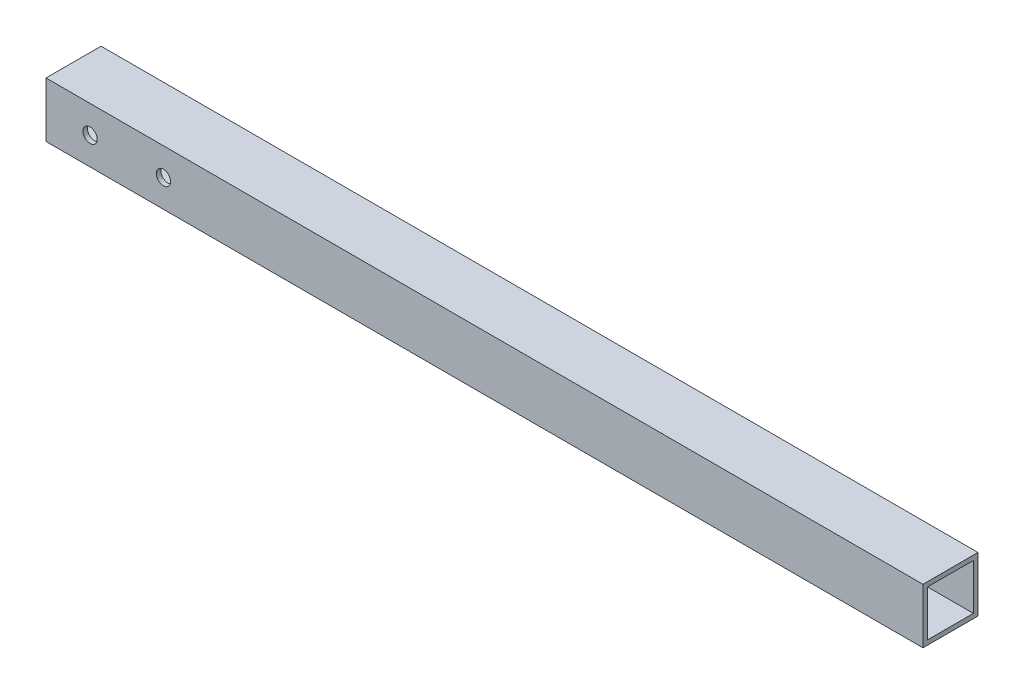
ISO-10303-21;
HEADER;
FILE_DESCRIPTION(('STEP AP214'),'2;1');
FILE_NAME('part.step','',(''),(''),'','','');
FILE_SCHEMA(('AUTOMOTIVE_DESIGN { 1 0 10303 214 1 1 1 1 }'));
ENDSEC;
DATA;
#1=APPLICATION_CONTEXT('core data for automotive mechanical design processes');
#2=APPLICATION_PROTOCOL_DEFINITION('international standard','automotive_design',2000,#1);
#3=PRODUCT_CONTEXT('',#1,'mechanical');
#4=PRODUCT('Part','Part','',(#3));
#5=PRODUCT_RELATED_PRODUCT_CATEGORY('part','',(#4));
#6=PRODUCT_DEFINITION_FORMATION('','',#4);
#7=PRODUCT_DEFINITION_CONTEXT('part definition',#1,'design');
#8=PRODUCT_DEFINITION('design','',#6,#7);
#9=PRODUCT_DEFINITION_SHAPE('','',#8);
#10=(LENGTH_UNIT() NAMED_UNIT(*) SI_UNIT(.MILLI.,.METRE.));
#11=(NAMED_UNIT(*) PLANE_ANGLE_UNIT() SI_UNIT($,.RADIAN.));
#12=(NAMED_UNIT(*) SI_UNIT($,.STERADIAN.) SOLID_ANGLE_UNIT());
#13=UNCERTAINTY_MEASURE_WITH_UNIT(LENGTH_MEASURE(1.E-05),#10,'distance_accuracy_value','');
#14=(GEOMETRIC_REPRESENTATION_CONTEXT(3) GLOBAL_UNCERTAINTY_ASSIGNED_CONTEXT((#13)) GLOBAL_UNIT_ASSIGNED_CONTEXT((#10,
#11,#12)) REPRESENTATION_CONTEXT('',''));
#15=CARTESIAN_POINT('',(0.,0.,0.));
#16=DIRECTION('',(0.,0.,1.));
#17=DIRECTION('',(1.,0.,0.));
#18=AXIS2_PLACEMENT_3D('',#15,#16,#17);
#19=CARTESIAN_POINT('',(238.95,0.,0.));
#20=DIRECTION('',(1.,0.,0.));
#21=DIRECTION('',(0.,0.,-1.));
#22=AXIS2_PLACEMENT_3D('',#19,#20,#21);
#23=PLANE('',#22);
#24=DIRECTION('',(0.,1.,0.));
#25=VECTOR('',#24,1.);
#26=CARTESIAN_POINT('',(238.95,7.5,-7.5));
#27=LINE('',#26,#25);
#28=CARTESIAN_POINT('',(238.95,-7.5,-7.5));
#29=VERTEX_POINT('',#28);
#30=CARTESIAN_POINT('',(238.95,7.5,-7.5));
#31=VERTEX_POINT('',#30);
#32=EDGE_CURVE('E139',#29,#31,#27,.T.);
#33=ORIENTED_EDGE('',*,*,#32,.T.);
#34=DIRECTION('',(0.,0.,1.));
#35=VECTOR('',#34,1.);
#36=CARTESIAN_POINT('',(238.95,7.5,7.5));
#37=LINE('',#36,#35);
#38=CARTESIAN_POINT('',(238.95,7.5,7.5));
#39=VERTEX_POINT('',#38);
#40=EDGE_CURVE('E142',#31,#39,#37,.T.);
#41=ORIENTED_EDGE('',*,*,#40,.T.);
#42=DIRECTION('',(0.,-1.,0.));
#43=VECTOR('',#42,1.);
#44=CARTESIAN_POINT('',(238.95,7.5,7.5));
#45=LINE('',#44,#43);
#46=CARTESIAN_POINT('',(238.95,-7.5,7.5));
#47=VERTEX_POINT('',#46);
#48=EDGE_CURVE('E145',#39,#47,#45,.T.);
#49=ORIENTED_EDGE('',*,*,#48,.T.);
#50=DIRECTION('',(0.,0.,-1.));
#51=VECTOR('',#50,1.);
#52=CARTESIAN_POINT('',(238.95,-7.5,7.5));
#53=LINE('',#52,#51);
#54=EDGE_CURVE('E147',#47,#29,#53,.T.);
#55=ORIENTED_EDGE('',*,*,#54,.T.);
#56=EDGE_LOOP('',(#33,#41,#49,#55));
#57=FACE_BOUND('',#56,.T.);
#58=DIRECTION('',(0.,-1.,0.));
#59=VECTOR('',#58,1.);
#60=CARTESIAN_POINT('',(238.95,6.25,6.25));
#61=LINE('',#60,#59);
#62=CARTESIAN_POINT('',(238.95,6.25,6.25));
#63=VERTEX_POINT('',#62);
#64=CARTESIAN_POINT('',(238.95,-6.25,6.25));
#65=VERTEX_POINT('',#64);
#66=EDGE_CURVE('E109',#63,#65,#61,.T.);
#67=ORIENTED_EDGE('',*,*,#66,.F.);
#68=DIRECTION('',(0.,0.,1.));
#69=VECTOR('',#68,1.);
#70=CARTESIAN_POINT('',(238.95,6.25,6.25));
#71=LINE('',#70,#69);
#72=CARTESIAN_POINT('',(238.95,6.25,-6.25));
#73=VERTEX_POINT('',#72);
#74=EDGE_CURVE('E101',#73,#63,#71,.T.);
#75=ORIENTED_EDGE('',*,*,#74,.F.);
#76=DIRECTION('',(0.,1.,0.));
#77=VECTOR('',#76,1.);
#78=CARTESIAN_POINT('',(238.95,6.25,-6.25));
#79=LINE('',#78,#77);
#80=CARTESIAN_POINT('',(238.95,-6.25,-6.25));
#81=VERTEX_POINT('',#80);
#82=EDGE_CURVE('E123',#81,#73,#79,.T.);
#83=ORIENTED_EDGE('',*,*,#82,.F.);
#84=DIRECTION('',(0.,0.,-1.));
#85=VECTOR('',#84,1.);
#86=CARTESIAN_POINT('',(238.95,-6.25,6.25));
#87=LINE('',#86,#85);
#88=EDGE_CURVE('E121',#65,#81,#87,.T.);
#89=ORIENTED_EDGE('',*,*,#88,.F.);
#90=EDGE_LOOP('',(#67,#75,#83,#89));
#91=FACE_BOUND('',#90,.T.);
#92=ADVANCED_FACE('F34',(#57,#91),#23,.T.);
#93=CARTESIAN_POINT('',(0.,0.,0.));
#94=DIRECTION('',(1.,0.,0.));
#95=DIRECTION('',(0.,0.,-1.));
#96=AXIS2_PLACEMENT_3D('',#93,#94,#95);
#97=PLANE('',#96);
#98=DIRECTION('',(0.,1.,0.));
#99=VECTOR('',#98,1.);
#100=CARTESIAN_POINT('',(0.,7.5,-7.5));
#101=LINE('',#100,#99);
#102=CARTESIAN_POINT('',(0.,-7.5,-7.5));
#103=VERTEX_POINT('',#102);
#104=CARTESIAN_POINT('',(0.,7.5,-7.5));
#105=VERTEX_POINT('',#104);
#106=EDGE_CURVE('E117',#103,#105,#101,.T.);
#107=ORIENTED_EDGE('',*,*,#106,.F.);
#108=DIRECTION('',(0.,0.,-1.));
#109=VECTOR('',#108,1.);
#110=CARTESIAN_POINT('',(0.,-7.5,7.5));
#111=LINE('',#110,#109);
#112=CARTESIAN_POINT('',(0.,-7.5,7.5));
#113=VERTEX_POINT('',#112);
#114=EDGE_CURVE('E143',#113,#103,#111,.T.);
#115=ORIENTED_EDGE('',*,*,#114,.F.);
#116=DIRECTION('',(0.,-1.,0.));
#117=VECTOR('',#116,1.);
#118=CARTESIAN_POINT('',(0.,7.5,7.5));
#119=LINE('',#118,#117);
#120=CARTESIAN_POINT('',(0.,7.5,7.5));
#121=VERTEX_POINT('',#120);
#122=EDGE_CURVE('E154',#121,#113,#119,.T.);
#123=ORIENTED_EDGE('',*,*,#122,.F.);
#124=DIRECTION('',(0.,0.,1.));
#125=VECTOR('',#124,1.);
#126=CARTESIAN_POINT('',(0.,7.5,7.5));
#127=LINE('',#126,#125);
#128=EDGE_CURVE('E152',#105,#121,#127,.T.);
#129=ORIENTED_EDGE('',*,*,#128,.F.);
#130=EDGE_LOOP('',(#107,#115,#123,#129));
#131=FACE_BOUND('',#130,.T.);
#132=DIRECTION('',(0.,0.,1.));
#133=VECTOR('',#132,1.);
#134=CARTESIAN_POINT('',(0.,6.25,6.25));
#135=LINE('',#134,#133);
#136=CARTESIAN_POINT('',(0.,6.25,-6.25));
#137=VERTEX_POINT('',#136);
#138=CARTESIAN_POINT('',(0.,6.25,6.25));
#139=VERTEX_POINT('',#138);
#140=EDGE_CURVE('E59',#137,#139,#135,.T.);
#141=ORIENTED_EDGE('',*,*,#140,.T.);
#142=DIRECTION('',(0.,-1.,0.));
#143=VECTOR('',#142,1.);
#144=CARTESIAN_POINT('',(0.,6.25,6.25));
#145=LINE('',#144,#143);
#146=CARTESIAN_POINT('',(0.,-6.25,6.25));
#147=VERTEX_POINT('',#146);
#148=EDGE_CURVE('E116',#139,#147,#145,.T.);
#149=ORIENTED_EDGE('',*,*,#148,.T.);
#150=DIRECTION('',(0.,0.,-1.));
#151=VECTOR('',#150,1.);
#152=CARTESIAN_POINT('',(0.,-6.25,6.25));
#153=LINE('',#152,#151);
#154=CARTESIAN_POINT('',(0.,-6.25,-6.25));
#155=VERTEX_POINT('',#154);
#156=EDGE_CURVE('E131',#147,#155,#153,.T.);
#157=ORIENTED_EDGE('',*,*,#156,.T.);
#158=DIRECTION('',(0.,1.,0.));
#159=VECTOR('',#158,1.);
#160=CARTESIAN_POINT('',(0.,6.25,-6.25));
#161=LINE('',#160,#159);
#162=EDGE_CURVE('E110',#155,#137,#161,.T.);
#163=ORIENTED_EDGE('',*,*,#162,.T.);
#164=EDGE_LOOP('',(#141,#149,#157,#163));
#165=FACE_BOUND('',#164,.T.);
#166=ADVANCED_FACE('F217',(#131,#165),#97,.F.);
#167=CARTESIAN_POINT('',(238.95,7.5,-7.5));
#168=DIRECTION('',(0.,0.,1.));
#169=DIRECTION('',(0.,-1.,0.));
#170=AXIS2_PLACEMENT_3D('',#167,#168,#169);
#171=PLANE('',#170);
#172=CARTESIAN_POINT('',(32.0000000007038,0.,-7.5));
#173=DIRECTION('',(0.,0.,-1.));
#174=DIRECTION('',(0.,1.,0.));
#175=AXIS2_PLACEMENT_3D('',#172,#173,#174);
#176=CIRCLE('',#175,1.95);
#177=CARTESIAN_POINT('',(32.0000000007038,1.95,-7.5));
#178=VERTEX_POINT('',#177);
#179=EDGE_CURVE('E174',#178,#178,#176,.T.);
#180=ORIENTED_EDGE('',*,*,#179,.F.);
#181=EDGE_LOOP('',(#180));
#182=FACE_BOUND('',#181,.T.);
#183=CARTESIAN_POINT('',(12.0000000007038,0.,-7.5));
#184=DIRECTION('',(0.,0.,-1.));
#185=DIRECTION('',(0.,1.,0.));
#186=AXIS2_PLACEMENT_3D('',#183,#184,#185);
#187=CIRCLE('',#186,1.95);
#188=CARTESIAN_POINT('',(12.0000000007038,1.95,-7.5));
#189=VERTEX_POINT('',#188);
#190=EDGE_CURVE('E192',#189,#189,#187,.T.);
#191=ORIENTED_EDGE('',*,*,#190,.F.);
#192=EDGE_LOOP('',(#191));
#193=FACE_BOUND('',#192,.T.);
#194=ORIENTED_EDGE('',*,*,#106,.T.);
#195=DIRECTION('',(-1.,0.,0.));
#196=VECTOR('',#195,1.);
#197=CARTESIAN_POINT('',(238.95,7.5,-7.5));
#198=LINE('',#197,#196);
#199=EDGE_CURVE('E11',#31,#105,#198,.T.);
#200=ORIENTED_EDGE('',*,*,#199,.F.);
#201=ORIENTED_EDGE('',*,*,#32,.F.);
#202=DIRECTION('',(-1.,0.,0.));
#203=VECTOR('',#202,1.);
#204=CARTESIAN_POINT('',(238.95,-7.5,-7.5));
#205=LINE('',#204,#203);
#206=EDGE_CURVE('E149',#29,#103,#205,.T.);
#207=ORIENTED_EDGE('',*,*,#206,.T.);
#208=EDGE_LOOP('',(#194,#200,#201,#207));
#209=FACE_BOUND('',#208,.T.);
#210=ADVANCED_FACE('F36',(#182,#193,#209),#171,.F.);
#211=CARTESIAN_POINT('',(238.95,7.5,7.5));
#212=DIRECTION('',(0.,-1.,0.));
#213=DIRECTION('',(0.,0.,-1.));
#214=AXIS2_PLACEMENT_3D('',#211,#212,#213);
#215=PLANE('',#214);
#216=ORIENTED_EDGE('',*,*,#128,.T.);
#217=DIRECTION('',(-1.,0.,0.));
#218=VECTOR('',#217,1.);
#219=CARTESIAN_POINT('',(238.95,7.5,7.5));
#220=LINE('',#219,#218);
#221=EDGE_CURVE('E43',#39,#121,#220,.T.);
#222=ORIENTED_EDGE('',*,*,#221,.F.);
#223=ORIENTED_EDGE('',*,*,#40,.F.);
#224=ORIENTED_EDGE('',*,*,#199,.T.);
#225=EDGE_LOOP('',(#216,#222,#223,#224));
#226=FACE_BOUND('',#225,.T.);
#227=ADVANCED_FACE('F231',(#226),#215,.F.);
#228=CARTESIAN_POINT('',(238.95,7.5,7.5));
#229=DIRECTION('',(0.,0.,-1.));
#230=DIRECTION('',(0.,1.,0.));
#231=AXIS2_PLACEMENT_3D('',#228,#229,#230);
#232=PLANE('',#231);
#233=CARTESIAN_POINT('',(32.0000000007038,0.,7.5));
#234=DIRECTION('',(0.,0.,-1.));
#235=DIRECTION('',(0.,1.,0.));
#236=AXIS2_PLACEMENT_3D('',#233,#234,#235);
#237=CIRCLE('',#236,1.95);
#238=CARTESIAN_POINT('',(32.0000000007038,1.94999999999999,7.5));
#239=VERTEX_POINT('',#238);
#240=EDGE_CURVE('E171',#239,#239,#237,.T.);
#241=ORIENTED_EDGE('',*,*,#240,.T.);
#242=EDGE_LOOP('',(#241));
#243=FACE_BOUND('',#242,.T.);
#244=CARTESIAN_POINT('',(12.0000000007038,0.,7.5));
#245=DIRECTION('',(0.,0.,-1.));
#246=DIRECTION('',(0.,1.,0.));
#247=AXIS2_PLACEMENT_3D('',#244,#245,#246);
#248=CIRCLE('',#247,1.95);
#249=CARTESIAN_POINT('',(12.0000000007038,1.95,7.5));
#250=VERTEX_POINT('',#249);
#251=EDGE_CURVE('E167',#250,#250,#248,.T.);
#252=ORIENTED_EDGE('',*,*,#251,.T.);
#253=EDGE_LOOP('',(#252));
#254=FACE_BOUND('',#253,.T.);
#255=ORIENTED_EDGE('',*,*,#122,.T.);
#256=DIRECTION('',(-1.,0.,0.));
#257=VECTOR('',#256,1.);
#258=CARTESIAN_POINT('',(238.95,-7.5,7.5));
#259=LINE('',#258,#257);
#260=EDGE_CURVE('E159',#47,#113,#259,.T.);
#261=ORIENTED_EDGE('',*,*,#260,.F.);
#262=ORIENTED_EDGE('',*,*,#48,.F.);
#263=ORIENTED_EDGE('',*,*,#221,.T.);
#264=EDGE_LOOP('',(#255,#261,#262,#263));
#265=FACE_BOUND('',#264,.T.);
#266=ADVANCED_FACE('F228',(#243,#254,#265),#232,.F.);
#267=CARTESIAN_POINT('',(238.95,-7.5,7.5));
#268=DIRECTION('',(0.,1.,0.));
#269=DIRECTION('',(0.,0.,1.));
#270=AXIS2_PLACEMENT_3D('',#267,#268,#269);
#271=PLANE('',#270);
#272=CARTESIAN_POINT('',(228.95,-7.5,0.));
#273=DIRECTION('',(0.,-1.,0.));
#274=DIRECTION('',(0.,0.,-1.));
#275=AXIS2_PLACEMENT_3D('',#272,#273,#274);
#276=CIRCLE('',#275,2.);
#277=CARTESIAN_POINT('',(228.95,-7.5,-2.));
#278=VERTEX_POINT('',#277);
#279=EDGE_CURVE('E185',#278,#278,#276,.T.);
#280=ORIENTED_EDGE('',*,*,#279,.F.);
#281=EDGE_LOOP('',(#280));
#282=FACE_BOUND('',#281,.T.);
#283=CARTESIAN_POINT('',(64.7,-7.5,0.));
#284=DIRECTION('',(0.,-1.,0.));
#285=DIRECTION('',(0.,0.,-1.));
#286=AXIS2_PLACEMENT_3D('',#283,#284,#285);
#287=CIRCLE('',#286,3.75000000000001);
#288=CARTESIAN_POINT('',(64.7,-7.5,-3.75000000000001));
#289=VERTEX_POINT('',#288);
#290=EDGE_CURVE('E175',#289,#289,#287,.T.);
#291=ORIENTED_EDGE('',*,*,#290,.F.);
#292=EDGE_LOOP('',(#291));
#293=FACE_BOUND('',#292,.T.);
#294=ORIENTED_EDGE('',*,*,#114,.T.);
#295=ORIENTED_EDGE('',*,*,#206,.F.);
#296=ORIENTED_EDGE('',*,*,#54,.F.);
#297=ORIENTED_EDGE('',*,*,#260,.T.);
#298=EDGE_LOOP('',(#294,#295,#296,#297));
#299=FACE_BOUND('',#298,.T.);
#300=ADVANCED_FACE('F213',(#282,#293,#299),#271,.F.);
#301=CARTESIAN_POINT('',(238.95,6.25,6.25));
#302=DIRECTION('',(0.,-1.,0.));
#303=DIRECTION('',(0.,0.,-1.));
#304=AXIS2_PLACEMENT_3D('',#301,#302,#303);
#305=PLANE('',#304);
#306=ORIENTED_EDGE('',*,*,#140,.F.);
#307=DIRECTION('',(-1.,0.,0.));
#308=VECTOR('',#307,1.);
#309=CARTESIAN_POINT('',(238.95,6.25,-6.25));
#310=LINE('',#309,#308);
#311=EDGE_CURVE('E105',#73,#137,#310,.T.);
#312=ORIENTED_EDGE('',*,*,#311,.F.);
#313=ORIENTED_EDGE('',*,*,#74,.T.);
#314=DIRECTION('',(-1.,0.,0.));
#315=VECTOR('',#314,1.);
#316=CARTESIAN_POINT('',(238.95,6.25,6.25));
#317=LINE('',#316,#315);
#318=EDGE_CURVE('E104',#63,#139,#317,.T.);
#319=ORIENTED_EDGE('',*,*,#318,.T.);
#320=EDGE_LOOP('',(#306,#312,#313,#319));
#321=FACE_BOUND('',#320,.T.);
#322=ADVANCED_FACE('F103',(#321),#305,.T.);
#323=CARTESIAN_POINT('',(238.95,6.25,6.25));
#324=DIRECTION('',(0.,0.,-1.));
#325=DIRECTION('',(0.,1.,0.));
#326=AXIS2_PLACEMENT_3D('',#323,#324,#325);
#327=PLANE('',#326);
#328=CARTESIAN_POINT('',(32.0000000007038,0.,6.25));
#329=DIRECTION('',(0.,0.,-1.));
#330=DIRECTION('',(0.,1.,0.));
#331=AXIS2_PLACEMENT_3D('',#328,#329,#330);
#332=CIRCLE('',#331,1.95);
#333=CARTESIAN_POINT('',(32.0000000007038,1.94999999999999,6.25));
#334=VERTEX_POINT('',#333);
#335=EDGE_CURVE('E170',#334,#334,#332,.T.);
#336=ORIENTED_EDGE('',*,*,#335,.F.);
#337=EDGE_LOOP('',(#336));
#338=FACE_BOUND('',#337,.T.);
#339=CARTESIAN_POINT('',(12.0000000007038,0.,6.25));
#340=DIRECTION('',(0.,0.,-1.));
#341=DIRECTION('',(0.,1.,0.));
#342=AXIS2_PLACEMENT_3D('',#339,#340,#341);
#343=CIRCLE('',#342,1.95);
#344=CARTESIAN_POINT('',(12.0000000007038,1.95,6.25));
#345=VERTEX_POINT('',#344);
#346=EDGE_CURVE('E129',#345,#345,#343,.T.);
#347=ORIENTED_EDGE('',*,*,#346,.F.);
#348=EDGE_LOOP('',(#347));
#349=FACE_BOUND('',#348,.T.);
#350=ORIENTED_EDGE('',*,*,#148,.F.);
#351=ORIENTED_EDGE('',*,*,#318,.F.);
#352=ORIENTED_EDGE('',*,*,#66,.T.);
#353=DIRECTION('',(-1.,0.,0.));
#354=VECTOR('',#353,1.);
#355=CARTESIAN_POINT('',(238.95,-6.25,6.25));
#356=LINE('',#355,#354);
#357=EDGE_CURVE('E118',#65,#147,#356,.T.);
#358=ORIENTED_EDGE('',*,*,#357,.T.);
#359=EDGE_LOOP('',(#350,#351,#352,#358));
#360=FACE_BOUND('',#359,.T.);
#361=ADVANCED_FACE('F113',(#338,#349,#360),#327,.T.);
#362=CARTESIAN_POINT('',(238.95,-6.25,6.25));
#363=DIRECTION('',(0.,1.,0.));
#364=DIRECTION('',(0.,0.,1.));
#365=AXIS2_PLACEMENT_3D('',#362,#363,#364);
#366=PLANE('',#365);
#367=CARTESIAN_POINT('',(228.95,-6.25,0.));
#368=DIRECTION('',(0.,1.,0.));
#369=DIRECTION('',(0.,0.,1.));
#370=AXIS2_PLACEMENT_3D('',#367,#368,#369);
#371=CIRCLE('',#370,2.);
#372=CARTESIAN_POINT('',(228.95,-6.25,2.));
#373=VERTEX_POINT('',#372);
#374=EDGE_CURVE('E38',#373,#373,#371,.T.);
#375=ORIENTED_EDGE('',*,*,#374,.F.);
#376=EDGE_LOOP('',(#375));
#377=FACE_BOUND('',#376,.T.);
#378=CARTESIAN_POINT('',(64.7,-6.25,0.));
#379=DIRECTION('',(0.,1.,0.));
#380=DIRECTION('',(0.,0.,1.));
#381=AXIS2_PLACEMENT_3D('',#378,#379,#380);
#382=CIRCLE('',#381,3.75000000000001);
#383=CARTESIAN_POINT('',(64.7,-6.25,3.75000000000001));
#384=VERTEX_POINT('',#383);
#385=EDGE_CURVE('E172',#384,#384,#382,.T.);
#386=ORIENTED_EDGE('',*,*,#385,.F.);
#387=EDGE_LOOP('',(#386));
#388=FACE_BOUND('',#387,.T.);
#389=ORIENTED_EDGE('',*,*,#156,.F.);
#390=ORIENTED_EDGE('',*,*,#357,.F.);
#391=ORIENTED_EDGE('',*,*,#88,.T.);
#392=DIRECTION('',(-1.,0.,0.));
#393=VECTOR('',#392,1.);
#394=CARTESIAN_POINT('',(238.95,-6.25,-6.25));
#395=LINE('',#394,#393);
#396=EDGE_CURVE('E51',#81,#155,#395,.T.);
#397=ORIENTED_EDGE('',*,*,#396,.T.);
#398=EDGE_LOOP('',(#389,#390,#391,#397));
#399=FACE_BOUND('',#398,.T.);
#400=ADVANCED_FACE('F203',(#377,#388,#399),#366,.T.);
#401=CARTESIAN_POINT('',(238.95,6.25,-6.25));
#402=DIRECTION('',(0.,0.,1.));
#403=DIRECTION('',(0.,-1.,0.));
#404=AXIS2_PLACEMENT_3D('',#401,#402,#403);
#405=PLANE('',#404);
#406=CARTESIAN_POINT('',(32.0000000007038,0.,-6.25));
#407=DIRECTION('',(0.,0.,1.));
#408=DIRECTION('',(0.,-1.,0.));
#409=AXIS2_PLACEMENT_3D('',#406,#407,#408);
#410=CIRCLE('',#409,1.95);
#411=CARTESIAN_POINT('',(32.0000000007038,1.95,-6.25));
#412=VERTEX_POINT('',#411);
#413=EDGE_CURVE('E168',#412,#412,#410,.T.);
#414=ORIENTED_EDGE('',*,*,#413,.F.);
#415=EDGE_LOOP('',(#414));
#416=FACE_BOUND('',#415,.T.);
#417=CARTESIAN_POINT('',(12.0000000007038,0.,-6.25));
#418=DIRECTION('',(0.,0.,1.));
#419=DIRECTION('',(0.,-1.,0.));
#420=AXIS2_PLACEMENT_3D('',#417,#418,#419);
#421=CIRCLE('',#420,1.95);
#422=CARTESIAN_POINT('',(12.0000000007038,1.95,-6.25));
#423=VERTEX_POINT('',#422);
#424=EDGE_CURVE('E164',#423,#423,#421,.T.);
#425=ORIENTED_EDGE('',*,*,#424,.F.);
#426=EDGE_LOOP('',(#425));
#427=FACE_BOUND('',#426,.T.);
#428=ORIENTED_EDGE('',*,*,#162,.F.);
#429=ORIENTED_EDGE('',*,*,#396,.F.);
#430=ORIENTED_EDGE('',*,*,#82,.T.);
#431=ORIENTED_EDGE('',*,*,#311,.T.);
#432=EDGE_LOOP('',(#428,#429,#430,#431));
#433=FACE_BOUND('',#432,.T.);
#434=ADVANCED_FACE('F210',(#416,#427,#433),#405,.T.);
#435=CARTESIAN_POINT('',(12.0000000007038,0.,7.5));
#436=DIRECTION('',(0.,0.,-1.));
#437=DIRECTION('',(0.,1.,0.));
#438=AXIS2_PLACEMENT_3D('',#435,#436,#437);
#439=CYLINDRICAL_SURFACE('',#438,1.95);
#440=CARTESIAN_POINT('',(12.0000000007038,1.95,-6.25));
#441=CARTESIAN_POINT('',(12.0000000007038,1.95,-6.26302083333333));
#442=CARTESIAN_POINT('',(12.0000000007038,1.95,-6.27604166666666));
#443=CARTESIAN_POINT('',(12.0000000007038,1.95,-6.30208333333333));
#444=CARTESIAN_POINT('',(12.0000000007038,1.95,-6.31510416666666));
#445=CARTESIAN_POINT('',(12.0000000007038,1.95,-6.34114583333333));
#446=CARTESIAN_POINT('',(12.0000000007038,1.95,-6.35416666666667));
#447=CARTESIAN_POINT('',(12.0000000007038,1.95,-6.38020833333333));
#448=CARTESIAN_POINT('',(12.0000000007038,1.95,-6.39322916666667));
#449=CARTESIAN_POINT('',(12.0000000007038,1.95,-6.41927083333333));
#450=CARTESIAN_POINT('',(12.0000000007038,1.95,-6.43229166666666));
#451=CARTESIAN_POINT('',(12.0000000007038,1.95,-6.45833333333333));
#452=CARTESIAN_POINT('',(12.0000000007038,1.95,-6.47135416666666));
#453=CARTESIAN_POINT('',(12.0000000007038,1.95,-6.49739583333333));
#454=CARTESIAN_POINT('',(12.0000000007038,1.95,-6.51041666666667));
#455=CARTESIAN_POINT('',(12.0000000007038,1.95,-6.53645833333333));
#456=CARTESIAN_POINT('',(12.0000000007038,1.95,-6.54947916666667));
#457=CARTESIAN_POINT('',(12.0000000007038,1.95,-6.57552083333333));
#458=CARTESIAN_POINT('',(12.0000000007038,1.95,-6.58854166666666));
#459=CARTESIAN_POINT('',(12.0000000007038,1.95,-6.61458333333333));
#460=CARTESIAN_POINT('',(12.0000000007038,1.95,-6.62760416666666));
#461=CARTESIAN_POINT('',(12.0000000007038,1.95,-6.65364583333333));
#462=CARTESIAN_POINT('',(12.0000000007038,1.95,-6.66666666666667));
#463=CARTESIAN_POINT('',(12.0000000007038,1.95,-6.69270833333333));
#464=CARTESIAN_POINT('',(12.0000000007038,1.95,-6.70572916666667));
#465=CARTESIAN_POINT('',(12.0000000007038,1.95,-6.73177083333333));
#466=CARTESIAN_POINT('',(12.0000000007038,1.95,-6.74479166666666));
#467=CARTESIAN_POINT('',(12.0000000007038,1.95,-6.77083333333333));
#468=CARTESIAN_POINT('',(12.0000000007038,1.95,-6.78385416666666));
#469=CARTESIAN_POINT('',(12.0000000007038,1.95,-6.80989583333333));
#470=CARTESIAN_POINT('',(12.0000000007038,1.95,-6.82291666666667));
#471=CARTESIAN_POINT('',(12.0000000007038,1.95,-6.84895833333333));
#472=CARTESIAN_POINT('',(12.0000000007038,1.95,-6.86197916666667));
#473=CARTESIAN_POINT('',(12.0000000007038,1.95,-6.88802083333333));
#474=CARTESIAN_POINT('',(12.0000000007038,1.95,-6.90104166666666));
#475=CARTESIAN_POINT('',(12.0000000007038,1.95,-6.92708333333333));
#476=CARTESIAN_POINT('',(12.0000000007038,1.95,-6.94010416666666));
#477=CARTESIAN_POINT('',(12.0000000007038,1.95,-6.96614583333333));
#478=CARTESIAN_POINT('',(12.0000000007038,1.95,-6.97916666666667));
#479=CARTESIAN_POINT('',(12.0000000007038,1.95,-7.00520833333333));
#480=CARTESIAN_POINT('',(12.0000000007038,1.95,-7.01822916666667));
#481=CARTESIAN_POINT('',(12.0000000007038,1.95,-7.04427083333333));
#482=CARTESIAN_POINT('',(12.0000000007038,1.95,-7.05729166666667));
#483=CARTESIAN_POINT('',(12.0000000007038,1.95,-7.08333333333333));
#484=CARTESIAN_POINT('',(12.0000000007038,1.95,-7.09635416666667));
#485=CARTESIAN_POINT('',(12.0000000007038,1.95,-7.12239583333333));
#486=CARTESIAN_POINT('',(12.0000000007038,1.95,-7.13541666666667));
#487=CARTESIAN_POINT('',(12.0000000007038,1.95,-7.16145833333333));
#488=CARTESIAN_POINT('',(12.0000000007038,1.95,-7.17447916666667));
#489=CARTESIAN_POINT('',(12.0000000007038,1.95,-7.20052083333333));
#490=CARTESIAN_POINT('',(12.0000000007038,1.95,-7.21354166666667));
#491=CARTESIAN_POINT('',(12.0000000007038,1.95,-7.23958333333333));
#492=CARTESIAN_POINT('',(12.0000000007038,1.95,-7.25260416666667));
#493=CARTESIAN_POINT('',(12.0000000007038,1.95,-7.27864583333333));
#494=CARTESIAN_POINT('',(12.0000000007038,1.95,-7.29166666666667));
#495=CARTESIAN_POINT('',(12.0000000007038,1.95,-7.31770833333333));
#496=CARTESIAN_POINT('',(12.0000000007038,1.95,-7.33072916666667));
#497=CARTESIAN_POINT('',(12.0000000007038,1.95,-7.35677083333333));
#498=CARTESIAN_POINT('',(12.0000000007038,1.95,-7.36979166666667));
#499=CARTESIAN_POINT('',(12.0000000007038,1.95,-7.39583333333333));
#500=CARTESIAN_POINT('',(12.0000000007038,1.95,-7.40885416666667));
#501=CARTESIAN_POINT('',(12.0000000007038,1.95,-7.43489583333333));
#502=CARTESIAN_POINT('',(12.0000000007038,1.95,-7.44791666666667));
#503=CARTESIAN_POINT('',(12.0000000007038,1.95,-7.47395833333333));
#504=CARTESIAN_POINT('',(12.0000000007038,1.95,-7.48697916666667));
#505=CARTESIAN_POINT('',(12.0000000007038,1.95,-7.5));
#506=B_SPLINE_CURVE_WITH_KNOTS('',3,(#440,#441,#442,#443,#444,#445,#446,#447,#448,#449,#450,
#451,#452,#453,#454,#455,#456,#457,#458,#459,#460,#461,#462,#463,#464,#465,#466,#467,#468,#469,
#470,#471,#472,#473,#474,#475,#476,#477,#478,#479,#480,#481,#482,#483,#484,#485,#486,#487,#488,
#489,#490,#491,#492,#493,#494,#495,#496,#497,#498,#499,#500,#501,#502,#503,#504,#505),
.UNSPECIFIED.,.F.,.F.,(4,2,2,2,2,2,2,2,2,2,2,2,2,2,2,2,2,2,2,2,2,2,2,2,2,2,2,2,2,2,2,2,4),(0.,
0.0390624999999992,0.0781250000000001,0.117187500000001,0.15625,0.195312499999999,0.234375,
0.273437500000001,0.3125,0.351562499999999,0.390625,0.429687500000001,0.46875,0.5078125,
0.546875,0.585937500000001,0.625000000000001,0.6640625,0.703125000000001,0.742187500000002,
0.781250000000001,0.8203125,0.859375000000001,0.898437500000002,0.937500000000001,0.9765625,
1.015625,1.0546875,1.09375,1.1328125,1.171875,1.2109375,1.25),.UNSPECIFIED.);
#507=EDGE_CURVE('BSEAM255',#423,#189,#506,.T.);
#508=ORIENTED_EDGE('',*,*,#424,.T.);
#509=ORIENTED_EDGE('',*,*,#190,.T.);
#510=ORIENTED_EDGE('',*,*,#507,.T.);
#511=ORIENTED_EDGE('',*,*,#507,.F.);
#512=EDGE_LOOP('',(#508,#510,#509,#511));
#513=FACE_BOUND('',#512,.T.);
#514=ADVANCED_FACE('F255',(#513),#439,.F.);
#515=CARTESIAN_POINT('',(12.0000000007038,1.95,6.25));
#516=CARTESIAN_POINT('',(12.0000000007038,1.95,6.26302083333333));
#517=CARTESIAN_POINT('',(12.0000000007038,1.95,6.27604166666667));
#518=CARTESIAN_POINT('',(12.0000000007038,1.95,6.30208333333333));
#519=CARTESIAN_POINT('',(12.0000000007038,1.95,6.31510416666667));
#520=CARTESIAN_POINT('',(12.0000000007038,1.95,6.34114583333333));
#521=CARTESIAN_POINT('',(12.0000000007038,1.95,6.35416666666667));
#522=CARTESIAN_POINT('',(12.0000000007038,1.95,6.38020833333333));
#523=CARTESIAN_POINT('',(12.0000000007038,1.95,6.39322916666667));
#524=CARTESIAN_POINT('',(12.0000000007038,1.95,6.41927083333333));
#525=CARTESIAN_POINT('',(12.0000000007038,1.95,6.43229166666667));
#526=CARTESIAN_POINT('',(12.0000000007038,1.95,6.45833333333333));
#527=CARTESIAN_POINT('',(12.0000000007038,1.95,6.47135416666667));
#528=CARTESIAN_POINT('',(12.0000000007038,1.95,6.49739583333333));
#529=CARTESIAN_POINT('',(12.0000000007038,1.95,6.51041666666667));
#530=CARTESIAN_POINT('',(12.0000000007038,1.95,6.53645833333333));
#531=CARTESIAN_POINT('',(12.0000000007038,1.95,6.54947916666667));
#532=CARTESIAN_POINT('',(12.0000000007038,1.95,6.57552083333333));
#533=CARTESIAN_POINT('',(12.0000000007038,1.95,6.58854166666667));
#534=CARTESIAN_POINT('',(12.0000000007038,1.95,6.61458333333333));
#535=CARTESIAN_POINT('',(12.0000000007038,1.95,6.62760416666667));
#536=CARTESIAN_POINT('',(12.0000000007038,1.95,6.65364583333333));
#537=CARTESIAN_POINT('',(12.0000000007038,1.95,6.66666666666667));
#538=CARTESIAN_POINT('',(12.0000000007038,1.95,6.69270833333333));
#539=CARTESIAN_POINT('',(12.0000000007038,1.95,6.70572916666667));
#540=CARTESIAN_POINT('',(12.0000000007038,1.95,6.73177083333334));
#541=CARTESIAN_POINT('',(12.0000000007038,1.95,6.74479166666667));
#542=CARTESIAN_POINT('',(12.0000000007038,1.95,6.77083333333334));
#543=CARTESIAN_POINT('',(12.0000000007038,1.95,6.78385416666667));
#544=CARTESIAN_POINT('',(12.0000000007038,1.95,6.80989583333334));
#545=CARTESIAN_POINT('',(12.0000000007038,1.95,6.82291666666667));
#546=CARTESIAN_POINT('',(12.0000000007038,1.95,6.84895833333334));
#547=CARTESIAN_POINT('',(12.0000000007038,1.95,6.86197916666667));
#548=CARTESIAN_POINT('',(12.0000000007038,1.95,6.88802083333334));
#549=CARTESIAN_POINT('',(12.0000000007038,1.95,6.90104166666667));
#550=CARTESIAN_POINT('',(12.0000000007038,1.95,6.92708333333334));
#551=CARTESIAN_POINT('',(12.0000000007038,1.95,6.94010416666667));
#552=CARTESIAN_POINT('',(12.0000000007038,1.95,6.96614583333334));
#553=CARTESIAN_POINT('',(12.0000000007038,1.95,6.97916666666667));
#554=CARTESIAN_POINT('',(12.0000000007038,1.95,7.00520833333334));
#555=CARTESIAN_POINT('',(12.0000000007038,1.95,7.01822916666667));
#556=CARTESIAN_POINT('',(12.0000000007038,1.95,7.04427083333334));
#557=CARTESIAN_POINT('',(12.0000000007038,1.95,7.05729166666667));
#558=CARTESIAN_POINT('',(12.0000000007038,1.95,7.08333333333334));
#559=CARTESIAN_POINT('',(12.0000000007038,1.95,7.09635416666667));
#560=CARTESIAN_POINT('',(12.0000000007038,1.95,7.12239583333334));
#561=CARTESIAN_POINT('',(12.0000000007038,1.95,7.13541666666667));
#562=CARTESIAN_POINT('',(12.0000000007038,1.95,7.16145833333334));
#563=CARTESIAN_POINT('',(12.0000000007038,1.95,7.17447916666667));
#564=CARTESIAN_POINT('',(12.0000000007038,1.95,7.20052083333334));
#565=CARTESIAN_POINT('',(12.0000000007038,1.95,7.21354166666667));
#566=CARTESIAN_POINT('',(12.0000000007038,1.95,7.23958333333334));
#567=CARTESIAN_POINT('',(12.0000000007038,1.95,7.25260416666667));
#568=CARTESIAN_POINT('',(12.0000000007038,1.95,7.27864583333334));
#569=CARTESIAN_POINT('',(12.0000000007038,1.95,7.29166666666667));
#570=CARTESIAN_POINT('',(12.0000000007038,1.95,7.31770833333334));
#571=CARTESIAN_POINT('',(12.0000000007038,1.95,7.33072916666667));
#572=CARTESIAN_POINT('',(12.0000000007038,1.95,7.35677083333334));
#573=CARTESIAN_POINT('',(12.0000000007038,1.95,7.36979166666667));
#574=CARTESIAN_POINT('',(12.0000000007038,1.95,7.39583333333334));
#575=CARTESIAN_POINT('',(12.0000000007038,1.95,7.40885416666667));
#576=CARTESIAN_POINT('',(12.0000000007038,1.95,7.43489583333334));
#577=CARTESIAN_POINT('',(12.0000000007038,1.95,7.44791666666667));
#578=CARTESIAN_POINT('',(12.0000000007038,1.95,7.47395833333334));
#579=CARTESIAN_POINT('',(12.0000000007038,1.95,7.48697916666667));
#580=CARTESIAN_POINT('',(12.0000000007038,1.95,7.5));
#581=B_SPLINE_CURVE_WITH_KNOTS('',3,(#515,#516,#517,#518,#519,#520,#521,#522,#523,#524,#525,
#526,#527,#528,#529,#530,#531,#532,#533,#534,#535,#536,#537,#538,#539,#540,#541,#542,#543,#544,
#545,#546,#547,#548,#549,#550,#551,#552,#553,#554,#555,#556,#557,#558,#559,#560,#561,#562,#563,
#564,#565,#566,#567,#568,#569,#570,#571,#572,#573,#574,#575,#576,#577,#578,#579,#580),
.UNSPECIFIED.,.F.,.F.,(4,2,2,2,2,2,2,2,2,2,2,2,2,2,2,2,2,2,2,2,2,2,2,2,2,2,2,2,2,2,2,2,4),(0.,
0.0390625,0.0781250000000001,0.1171875,0.15625,0.1953125,0.234375,0.2734375,0.3125,0.3515625,
0.390625,0.4296875,0.46875,0.5078125,0.546875,0.585937500000001,0.625000000000001,
0.664062500000001,0.703125000000001,0.742187500000001,0.781250000000001,0.820312500000001,
0.859375000000001,0.898437500000001,0.937500000000001,0.976562500000001,1.015625,1.0546875,
1.09375,1.1328125,1.171875,1.2109375,1.25),.UNSPECIFIED.);
#582=EDGE_CURVE('BSEAM199',#345,#250,#581,.T.);
#583=ORIENTED_EDGE('',*,*,#346,.T.);
#584=ORIENTED_EDGE('',*,*,#251,.F.);
#585=ORIENTED_EDGE('',*,*,#582,.T.);
#586=ORIENTED_EDGE('',*,*,#582,.F.);
#587=EDGE_LOOP('',(#583,#585,#584,#586));
#588=FACE_BOUND('',#587,.T.);
#589=ADVANCED_FACE('F199',(#588),#439,.F.);
#590=CARTESIAN_POINT('',(32.0000000007038,0.,7.5));
#591=DIRECTION('',(0.,0.,-1.));
#592=DIRECTION('',(0.,1.,0.));
#593=AXIS2_PLACEMENT_3D('',#590,#591,#592);
#594=CYLINDRICAL_SURFACE('',#593,1.95);
#595=CARTESIAN_POINT('',(32.0000000007038,1.95,-6.25));
#596=CARTESIAN_POINT('',(32.0000000007038,1.95,-6.26302083333333));
#597=CARTESIAN_POINT('',(32.0000000007038,1.95,-6.27604166666666));
#598=CARTESIAN_POINT('',(32.0000000007038,1.95,-6.30208333333333));
#599=CARTESIAN_POINT('',(32.0000000007038,1.95,-6.31510416666666));
#600=CARTESIAN_POINT('',(32.0000000007038,1.95,-6.34114583333333));
#601=CARTESIAN_POINT('',(32.0000000007038,1.95,-6.35416666666667));
#602=CARTESIAN_POINT('',(32.0000000007038,1.95,-6.38020833333333));
#603=CARTESIAN_POINT('',(32.0000000007038,1.95,-6.39322916666667));
#604=CARTESIAN_POINT('',(32.0000000007038,1.95,-6.41927083333333));
#605=CARTESIAN_POINT('',(32.0000000007038,1.95,-6.43229166666666));
#606=CARTESIAN_POINT('',(32.0000000007038,1.95,-6.45833333333333));
#607=CARTESIAN_POINT('',(32.0000000007038,1.95,-6.47135416666666));
#608=CARTESIAN_POINT('',(32.0000000007038,1.95,-6.49739583333333));
#609=CARTESIAN_POINT('',(32.0000000007038,1.95,-6.51041666666667));
#610=CARTESIAN_POINT('',(32.0000000007038,1.95,-6.53645833333333));
#611=CARTESIAN_POINT('',(32.0000000007038,1.95,-6.54947916666667));
#612=CARTESIAN_POINT('',(32.0000000007038,1.95,-6.57552083333333));
#613=CARTESIAN_POINT('',(32.0000000007038,1.95,-6.58854166666666));
#614=CARTESIAN_POINT('',(32.0000000007038,1.95,-6.61458333333333));
#615=CARTESIAN_POINT('',(32.0000000007038,1.95,-6.62760416666666));
#616=CARTESIAN_POINT('',(32.0000000007038,1.95,-6.65364583333333));
#617=CARTESIAN_POINT('',(32.0000000007038,1.95,-6.66666666666667));
#618=CARTESIAN_POINT('',(32.0000000007038,1.95,-6.69270833333333));
#619=CARTESIAN_POINT('',(32.0000000007038,1.95,-6.70572916666667));
#620=CARTESIAN_POINT('',(32.0000000007038,1.95,-6.73177083333333));
#621=CARTESIAN_POINT('',(32.0000000007038,1.95,-6.74479166666666));
#622=CARTESIAN_POINT('',(32.0000000007038,1.95,-6.77083333333333));
#623=CARTESIAN_POINT('',(32.0000000007038,1.95,-6.78385416666666));
#624=CARTESIAN_POINT('',(32.0000000007038,1.95,-6.80989583333333));
#625=CARTESIAN_POINT('',(32.0000000007038,1.95,-6.82291666666667));
#626=CARTESIAN_POINT('',(32.0000000007038,1.95,-6.84895833333333));
#627=CARTESIAN_POINT('',(32.0000000007038,1.95,-6.86197916666667));
#628=CARTESIAN_POINT('',(32.0000000007038,1.95,-6.88802083333333));
#629=CARTESIAN_POINT('',(32.0000000007038,1.95,-6.90104166666666));
#630=CARTESIAN_POINT('',(32.0000000007038,1.95,-6.92708333333333));
#631=CARTESIAN_POINT('',(32.0000000007038,1.95,-6.94010416666666));
#632=CARTESIAN_POINT('',(32.0000000007038,1.95,-6.96614583333333));
#633=CARTESIAN_POINT('',(32.0000000007038,1.95,-6.97916666666667));
#634=CARTESIAN_POINT('',(32.0000000007038,1.95,-7.00520833333333));
#635=CARTESIAN_POINT('',(32.0000000007038,1.95,-7.01822916666667));
#636=CARTESIAN_POINT('',(32.0000000007038,1.95,-7.04427083333333));
#637=CARTESIAN_POINT('',(32.0000000007038,1.95,-7.05729166666667));
#638=CARTESIAN_POINT('',(32.0000000007038,1.95,-7.08333333333333));
#639=CARTESIAN_POINT('',(32.0000000007038,1.95,-7.09635416666667));
#640=CARTESIAN_POINT('',(32.0000000007038,1.95,-7.12239583333333));
#641=CARTESIAN_POINT('',(32.0000000007038,1.95,-7.13541666666667));
#642=CARTESIAN_POINT('',(32.0000000007038,1.95,-7.16145833333333));
#643=CARTESIAN_POINT('',(32.0000000007038,1.95,-7.17447916666667));
#644=CARTESIAN_POINT('',(32.0000000007038,1.95,-7.20052083333333));
#645=CARTESIAN_POINT('',(32.0000000007038,1.95,-7.21354166666667));
#646=CARTESIAN_POINT('',(32.0000000007038,1.95,-7.23958333333333));
#647=CARTESIAN_POINT('',(32.0000000007038,1.95,-7.25260416666667));
#648=CARTESIAN_POINT('',(32.0000000007038,1.95,-7.27864583333333));
#649=CARTESIAN_POINT('',(32.0000000007038,1.95,-7.29166666666667));
#650=CARTESIAN_POINT('',(32.0000000007038,1.95,-7.31770833333333));
#651=CARTESIAN_POINT('',(32.0000000007038,1.95,-7.33072916666667));
#652=CARTESIAN_POINT('',(32.0000000007038,1.95,-7.35677083333333));
#653=CARTESIAN_POINT('',(32.0000000007038,1.95,-7.36979166666667));
#654=CARTESIAN_POINT('',(32.0000000007038,1.95,-7.39583333333333));
#655=CARTESIAN_POINT('',(32.0000000007038,1.95,-7.40885416666667));
#656=CARTESIAN_POINT('',(32.0000000007038,1.95,-7.43489583333333));
#657=CARTESIAN_POINT('',(32.0000000007038,1.95,-7.44791666666667));
#658=CARTESIAN_POINT('',(32.0000000007038,1.95,-7.47395833333333));
#659=CARTESIAN_POINT('',(32.0000000007038,1.95,-7.48697916666667));
#660=CARTESIAN_POINT('',(32.0000000007038,1.95,-7.5));
#661=B_SPLINE_CURVE_WITH_KNOTS('',3,(#595,#596,#597,#598,#599,#600,#601,#602,#603,#604,#605,
#606,#607,#608,#609,#610,#611,#612,#613,#614,#615,#616,#617,#618,#619,#620,#621,#622,#623,#624,
#625,#626,#627,#628,#629,#630,#631,#632,#633,#634,#635,#636,#637,#638,#639,#640,#641,#642,#643,
#644,#645,#646,#647,#648,#649,#650,#651,#652,#653,#654,#655,#656,#657,#658,#659,#660),
.UNSPECIFIED.,.F.,.F.,(4,2,2,2,2,2,2,2,2,2,2,2,2,2,2,2,2,2,2,2,2,2,2,2,2,2,2,2,2,2,2,2,4),(0.,
0.0390624999999992,0.0781250000000001,0.117187500000001,0.15625,0.195312499999999,0.234375,
0.273437500000001,0.3125,0.351562499999999,0.390625,0.429687500000001,0.46875,0.5078125,
0.546875,0.585937500000001,0.625000000000001,0.6640625,0.703125000000001,0.742187500000002,
0.781250000000001,0.8203125,0.859375000000001,0.898437500000002,0.937500000000001,0.9765625,
1.015625,1.0546875,1.09375,1.1328125,1.171875,1.2109375,1.25),.UNSPECIFIED.);
#662=EDGE_CURVE('BSEAM266',#412,#178,#661,.T.);
#663=ORIENTED_EDGE('',*,*,#413,.T.);
#664=ORIENTED_EDGE('',*,*,#179,.T.);
#665=ORIENTED_EDGE('',*,*,#662,.T.);
#666=ORIENTED_EDGE('',*,*,#662,.F.);
#667=EDGE_LOOP('',(#663,#665,#664,#666));
#668=FACE_BOUND('',#667,.T.);
#669=ADVANCED_FACE('F266',(#668),#594,.F.);
#670=CARTESIAN_POINT('',(32.0000000007038,1.94999999999999,6.25));
#671=CARTESIAN_POINT('',(32.0000000007038,1.94999999999999,6.26302083333333));
#672=CARTESIAN_POINT('',(32.0000000007038,1.94999999999999,6.27604166666667));
#673=CARTESIAN_POINT('',(32.0000000007038,1.94999999999999,6.30208333333333));
#674=CARTESIAN_POINT('',(32.0000000007038,1.94999999999999,6.31510416666667));
#675=CARTESIAN_POINT('',(32.0000000007038,1.94999999999999,6.34114583333333));
#676=CARTESIAN_POINT('',(32.0000000007038,1.94999999999999,6.35416666666667));
#677=CARTESIAN_POINT('',(32.0000000007038,1.94999999999999,6.38020833333333));
#678=CARTESIAN_POINT('',(32.0000000007038,1.94999999999999,6.39322916666667));
#679=CARTESIAN_POINT('',(32.0000000007038,1.94999999999999,6.41927083333333));
#680=CARTESIAN_POINT('',(32.0000000007038,1.94999999999999,6.43229166666667));
#681=CARTESIAN_POINT('',(32.0000000007038,1.94999999999999,6.45833333333333));
#682=CARTESIAN_POINT('',(32.0000000007038,1.94999999999999,6.47135416666667));
#683=CARTESIAN_POINT('',(32.0000000007038,1.94999999999999,6.49739583333333));
#684=CARTESIAN_POINT('',(32.0000000007038,1.94999999999999,6.51041666666667));
#685=CARTESIAN_POINT('',(32.0000000007038,1.94999999999999,6.53645833333333));
#686=CARTESIAN_POINT('',(32.0000000007038,1.94999999999999,6.54947916666667));
#687=CARTESIAN_POINT('',(32.0000000007038,1.94999999999999,6.57552083333333));
#688=CARTESIAN_POINT('',(32.0000000007038,1.94999999999999,6.58854166666667));
#689=CARTESIAN_POINT('',(32.0000000007038,1.94999999999999,6.61458333333333));
#690=CARTESIAN_POINT('',(32.0000000007038,1.94999999999999,6.62760416666667));
#691=CARTESIAN_POINT('',(32.0000000007038,1.94999999999999,6.65364583333333));
#692=CARTESIAN_POINT('',(32.0000000007038,1.94999999999999,6.66666666666667));
#693=CARTESIAN_POINT('',(32.0000000007038,1.94999999999999,6.69270833333333));
#694=CARTESIAN_POINT('',(32.0000000007038,1.94999999999999,6.70572916666667));
#695=CARTESIAN_POINT('',(32.0000000007038,1.94999999999999,6.73177083333334));
#696=CARTESIAN_POINT('',(32.0000000007038,1.94999999999999,6.74479166666667));
#697=CARTESIAN_POINT('',(32.0000000007038,1.94999999999999,6.77083333333334));
#698=CARTESIAN_POINT('',(32.0000000007038,1.94999999999999,6.78385416666667));
#699=CARTESIAN_POINT('',(32.0000000007038,1.94999999999999,6.80989583333334));
#700=CARTESIAN_POINT('',(32.0000000007038,1.94999999999999,6.82291666666667));
#701=CARTESIAN_POINT('',(32.0000000007038,1.94999999999999,6.84895833333334));
#702=CARTESIAN_POINT('',(32.0000000007038,1.94999999999999,6.86197916666667));
#703=CARTESIAN_POINT('',(32.0000000007038,1.94999999999999,6.88802083333334));
#704=CARTESIAN_POINT('',(32.0000000007038,1.94999999999999,6.90104166666667));
#705=CARTESIAN_POINT('',(32.0000000007038,1.94999999999999,6.92708333333334));
#706=CARTESIAN_POINT('',(32.0000000007038,1.94999999999999,6.94010416666667));
#707=CARTESIAN_POINT('',(32.0000000007038,1.94999999999999,6.96614583333334));
#708=CARTESIAN_POINT('',(32.0000000007038,1.94999999999999,6.97916666666667));
#709=CARTESIAN_POINT('',(32.0000000007038,1.94999999999999,7.00520833333334));
#710=CARTESIAN_POINT('',(32.0000000007038,1.94999999999999,7.01822916666667));
#711=CARTESIAN_POINT('',(32.0000000007038,1.94999999999999,7.04427083333334));
#712=CARTESIAN_POINT('',(32.0000000007038,1.94999999999999,7.05729166666667));
#713=CARTESIAN_POINT('',(32.0000000007038,1.94999999999999,7.08333333333334));
#714=CARTESIAN_POINT('',(32.0000000007038,1.94999999999999,7.09635416666667));
#715=CARTESIAN_POINT('',(32.0000000007038,1.94999999999999,7.12239583333334));
#716=CARTESIAN_POINT('',(32.0000000007038,1.94999999999999,7.13541666666667));
#717=CARTESIAN_POINT('',(32.0000000007038,1.94999999999999,7.16145833333334));
#718=CARTESIAN_POINT('',(32.0000000007038,1.94999999999999,7.17447916666667));
#719=CARTESIAN_POINT('',(32.0000000007038,1.94999999999999,7.20052083333334));
#720=CARTESIAN_POINT('',(32.0000000007038,1.94999999999999,7.21354166666667));
#721=CARTESIAN_POINT('',(32.0000000007038,1.94999999999999,7.23958333333334));
#722=CARTESIAN_POINT('',(32.0000000007038,1.94999999999999,7.25260416666667));
#723=CARTESIAN_POINT('',(32.0000000007038,1.94999999999999,7.27864583333334));
#724=CARTESIAN_POINT('',(32.0000000007038,1.94999999999999,7.29166666666667));
#725=CARTESIAN_POINT('',(32.0000000007038,1.94999999999999,7.31770833333334));
#726=CARTESIAN_POINT('',(32.0000000007038,1.94999999999999,7.33072916666667));
#727=CARTESIAN_POINT('',(32.0000000007038,1.94999999999999,7.35677083333334));
#728=CARTESIAN_POINT('',(32.0000000007038,1.94999999999999,7.36979166666667));
#729=CARTESIAN_POINT('',(32.0000000007038,1.94999999999999,7.39583333333334));
#730=CARTESIAN_POINT('',(32.0000000007038,1.94999999999999,7.40885416666667));
#731=CARTESIAN_POINT('',(32.0000000007038,1.94999999999999,7.43489583333334));
#732=CARTESIAN_POINT('',(32.0000000007038,1.94999999999999,7.44791666666667));
#733=CARTESIAN_POINT('',(32.0000000007038,1.94999999999999,7.47395833333334));
#734=CARTESIAN_POINT('',(32.0000000007038,1.94999999999999,7.48697916666667));
#735=CARTESIAN_POINT('',(32.0000000007038,1.94999999999999,7.5));
#736=B_SPLINE_CURVE_WITH_KNOTS('',3,(#670,#671,#672,#673,#674,#675,#676,#677,#678,#679,#680,
#681,#682,#683,#684,#685,#686,#687,#688,#689,#690,#691,#692,#693,#694,#695,#696,#697,#698,#699,
#700,#701,#702,#703,#704,#705,#706,#707,#708,#709,#710,#711,#712,#713,#714,#715,#716,#717,#718,
#719,#720,#721,#722,#723,#724,#725,#726,#727,#728,#729,#730,#731,#732,#733,#734,#735),
.UNSPECIFIED.,.F.,.F.,(4,2,2,2,2,2,2,2,2,2,2,2,2,2,2,2,2,2,2,2,2,2,2,2,2,2,2,2,2,2,2,2,4),(0.,
0.0390625,0.0781250000000001,0.1171875,0.15625,0.1953125,0.234375,0.2734375,0.3125,0.3515625,
0.390625,0.4296875,0.46875,0.5078125,0.546875,0.585937500000001,0.625000000000001,
0.664062500000001,0.703125000000001,0.742187500000001,0.781250000000001,0.820312500000001,
0.859375000000001,0.898437500000001,0.937500000000001,0.976562500000001,1.015625,1.0546875,
1.09375,1.1328125,1.171875,1.2109375,1.25),.UNSPECIFIED.);
#737=EDGE_CURVE('BSEAM269',#334,#239,#736,.T.);
#738=ORIENTED_EDGE('',*,*,#335,.T.);
#739=ORIENTED_EDGE('',*,*,#240,.F.);
#740=ORIENTED_EDGE('',*,*,#737,.T.);
#741=ORIENTED_EDGE('',*,*,#737,.F.);
#742=EDGE_LOOP('',(#738,#740,#739,#741));
#743=FACE_BOUND('',#742,.T.);
#744=ADVANCED_FACE('F269',(#743),#594,.F.);
#745=CARTESIAN_POINT('',(64.7,-2.5,0.));
#746=DIRECTION('',(0.,-1.,0.));
#747=DIRECTION('',(0.,0.,-1.));
#748=AXIS2_PLACEMENT_3D('',#745,#746,#747);
#749=CYLINDRICAL_SURFACE('',#748,3.75000000000001);
#750=ORIENTED_EDGE('',*,*,#385,.T.);
#751=EDGE_LOOP('',(#750));
#752=FACE_BOUND('',#751,.T.);
#753=ORIENTED_EDGE('',*,*,#290,.T.);
#754=EDGE_LOOP('',(#753));
#755=FACE_BOUND('',#754,.T.);
#756=ADVANCED_FACE('F271',(#752,#755),#749,.F.);
#757=CARTESIAN_POINT('',(228.95,-2.5,0.));
#758=DIRECTION('',(0.,-1.,0.));
#759=DIRECTION('',(0.,0.,-1.));
#760=AXIS2_PLACEMENT_3D('',#757,#758,#759);
#761=CYLINDRICAL_SURFACE('',#760,2.);
#762=ORIENTED_EDGE('',*,*,#374,.T.);
#763=EDGE_LOOP('',(#762));
#764=FACE_BOUND('',#763,.T.);
#765=ORIENTED_EDGE('',*,*,#279,.T.);
#766=EDGE_LOOP('',(#765));
#767=FACE_BOUND('',#766,.T.);
#768=ADVANCED_FACE('F274',(#764,#767),#761,.F.);
#769=CLOSED_SHELL('',(#92,#166,#210,#227,#266,#300,#322,#361,#400,#434,#514,#589,#669,#744,#756,#768));
#770=MANIFOLD_SOLID_BREP('B2',#769);
#771=ADVANCED_BREP_SHAPE_REPRESENTATION('',(#18,#770),#14);
#772=SHAPE_DEFINITION_REPRESENTATION(#9,#771);
ENDSEC;
END-ISO-10303-21;
